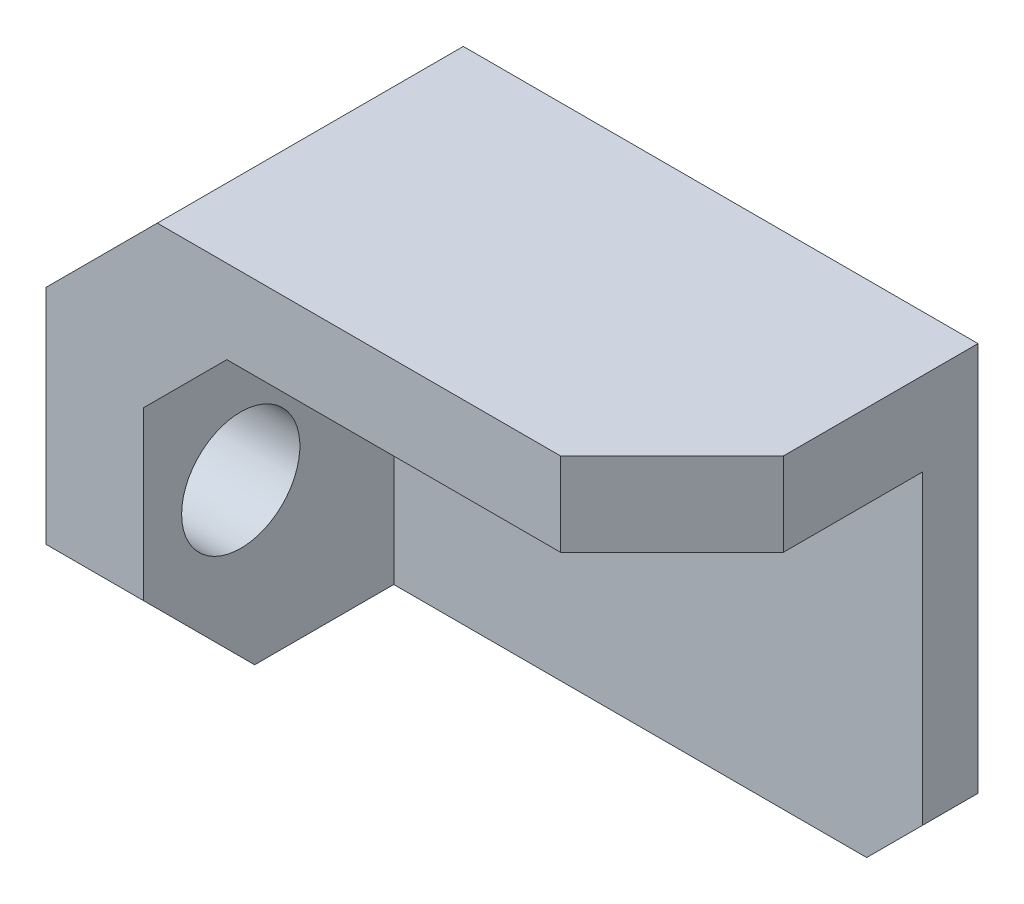
ISO-10303-21;
HEADER;
FILE_DESCRIPTION(('STEP AP214'),'2;1');
FILE_NAME('part.step','',(''),(''),'','','');
FILE_SCHEMA(('AUTOMOTIVE_DESIGN { 1 0 10303 214 1 1 1 1 }'));
ENDSEC;
DATA;
#1=APPLICATION_CONTEXT('core data for automotive mechanical design processes');
#2=APPLICATION_PROTOCOL_DEFINITION('international standard','automotive_design',2000,#1);
#3=PRODUCT_CONTEXT('',#1,'mechanical');
#4=PRODUCT('Part','Part','',(#3));
#5=PRODUCT_RELATED_PRODUCT_CATEGORY('part','',(#4));
#6=PRODUCT_DEFINITION_FORMATION('','',#4);
#7=PRODUCT_DEFINITION_CONTEXT('part definition',#1,'design');
#8=PRODUCT_DEFINITION('design','',#6,#7);
#9=PRODUCT_DEFINITION_SHAPE('','',#8);
#10=(LENGTH_UNIT() NAMED_UNIT(*) SI_UNIT(.MILLI.,.METRE.));
#11=(NAMED_UNIT(*) PLANE_ANGLE_UNIT() SI_UNIT($,.RADIAN.));
#12=(NAMED_UNIT(*) SI_UNIT($,.STERADIAN.) SOLID_ANGLE_UNIT());
#13=UNCERTAINTY_MEASURE_WITH_UNIT(LENGTH_MEASURE(1.E-05),#10,'distance_accuracy_value','');
#14=(GEOMETRIC_REPRESENTATION_CONTEXT(3) GLOBAL_UNCERTAINTY_ASSIGNED_CONTEXT((#13)) GLOBAL_UNIT_ASSIGNED_CONTEXT((#10,
#11,#12)) REPRESENTATION_CONTEXT('',''));
#15=CARTESIAN_POINT('',(0.,0.,0.));
#16=DIRECTION('',(0.,0.,1.));
#17=DIRECTION('',(1.,0.,0.));
#18=AXIS2_PLACEMENT_3D('',#15,#16,#17);
#19=CARTESIAN_POINT('',(0.,0.,22.));
#20=DIRECTION('',(1.,0.,0.));
#21=DIRECTION('',(0.,0.,-1.));
#22=AXIS2_PLACEMENT_3D('',#19,#20,#21);
#23=PLANE('',#22);
#24=CARTESIAN_POINT('',(0.,12.,15.));
#25=DIRECTION('',(1.,0.,0.));
#26=DIRECTION('',(0.,0.,-1.));
#27=AXIS2_PLACEMENT_3D('',#24,#25,#26);
#28=CIRCLE('',#27,4.25000000000001);
#29=CARTESIAN_POINT('',(0.,12.,19.25));
#30=VERTEX_POINT('',#29);
#31=EDGE_CURVE('E162',#30,#30,#28,.T.);
#32=ORIENTED_EDGE('',*,*,#31,.T.);
#33=EDGE_LOOP('',(#32));
#34=FACE_BOUND('',#33,.T.);
#35=DIRECTION('',(0.,-1.,0.));
#36=VECTOR('',#35,1.);
#37=CARTESIAN_POINT('',(0.,0.,22.));
#38=LINE('',#37,#36);
#39=CARTESIAN_POINT('',(0.,24.,22.));
#40=VERTEX_POINT('',#39);
#41=CARTESIAN_POINT('',(0.,8.00000000000001,22.));
#42=VERTEX_POINT('',#41);
#43=EDGE_CURVE('E170',#40,#42,#38,.T.);
#44=ORIENTED_EDGE('',*,*,#43,.F.);
#45=DIRECTION('',(0.,0.,-1.));
#46=VECTOR('',#45,1.);
#47=CARTESIAN_POINT('',(0.,24.,22.));
#48=LINE('',#47,#46);
#49=CARTESIAN_POINT('',(0.,24.,0.));
#50=VERTEX_POINT('',#49);
#51=EDGE_CURVE('E196',#40,#50,#48,.T.);
#52=ORIENTED_EDGE('',*,*,#51,.T.);
#53=DIRECTION('',(0.,-1.,0.));
#54=VECTOR('',#53,1.);
#55=CARTESIAN_POINT('',(0.,0.,0.));
#56=LINE('',#55,#54);
#57=CARTESIAN_POINT('',(0.,0.,0.));
#58=VERTEX_POINT('',#57);
#59=EDGE_CURVE('E169',#50,#58,#56,.T.);
#60=ORIENTED_EDGE('',*,*,#59,.T.);
#61=DIRECTION('',(0.,0.,-1.));
#62=VECTOR('',#61,1.);
#63=CARTESIAN_POINT('',(0.,0.,22.));
#64=LINE('',#63,#62);
#65=CARTESIAN_POINT('',(0.,0.,14.));
#66=VERTEX_POINT('',#65);
#67=EDGE_CURVE('E188',#66,#58,#64,.T.);
#68=ORIENTED_EDGE('',*,*,#67,.F.);
#69=DIRECTION('',(0.,-0.707106781186547,-0.707106781186549));
#70=VECTOR('',#69,1.);
#71=CARTESIAN_POINT('',(0.,8.00000000000001,22.));
#72=LINE('',#71,#70);
#73=EDGE_CURVE('E190',#66,#42,#72,.F.);
#74=ORIENTED_EDGE('',*,*,#73,.T.);
#75=EDGE_LOOP('',(#44,#52,#60,#68,#74));
#76=FACE_BOUND('',#75,.T.);
#77=ADVANCED_FACE('F33',(#34,#76),#23,.F.);
#78=CARTESIAN_POINT('',(0.,0.,22.));
#79=DIRECTION('',(0.,1.,0.));
#80=DIRECTION('',(0.,0.,1.));
#81=AXIS2_PLACEMENT_3D('',#78,#79,#80);
#82=PLANE('',#81);
#83=DIRECTION('',(1.,0.,0.));
#84=VECTOR('',#83,1.);
#85=CARTESIAN_POINT('',(0.,0.,0.));
#86=LINE('',#85,#84);
#87=CARTESIAN_POINT('',(41.,0.,0.));
#88=VERTEX_POINT('',#87);
#89=EDGE_CURVE('E180',#58,#88,#86,.T.);
#90=ORIENTED_EDGE('',*,*,#89,.T.);
#91=DIRECTION('',(0.,0.,1.));
#92=VECTOR('',#91,1.);
#93=CARTESIAN_POINT('',(41.,0.,22.));
#94=LINE('',#93,#92);
#95=CARTESIAN_POINT('',(41.,0.,4.));
#96=VERTEX_POINT('',#95);
#97=EDGE_CURVE('E41',#88,#96,#94,.T.);
#98=ORIENTED_EDGE('',*,*,#97,.T.);
#99=DIRECTION('',(1.,0.,0.));
#100=VECTOR('',#99,1.);
#101=CARTESIAN_POINT('',(7.00000000000001,0.,4.));
#102=LINE('',#101,#100);
#103=CARTESIAN_POINT('',(7.00000000000001,0.,4.));
#104=VERTEX_POINT('',#103);
#105=EDGE_CURVE('E146',#104,#96,#102,.T.);
#106=ORIENTED_EDGE('',*,*,#105,.F.);
#107=DIRECTION('',(0.,0.,-1.));
#108=VECTOR('',#107,1.);
#109=CARTESIAN_POINT('',(7.00000000000001,0.,22.));
#110=LINE('',#109,#108);
#111=CARTESIAN_POINT('',(7.00000000000001,0.,14.));
#112=VERTEX_POINT('',#111);
#113=EDGE_CURVE('E145',#112,#104,#110,.T.);
#114=ORIENTED_EDGE('',*,*,#113,.F.);
#115=DIRECTION('',(-1.,0.,0.));
#116=VECTOR('',#115,1.);
#117=CARTESIAN_POINT('',(0.,0.,14.));
#118=LINE('',#117,#116);
#119=EDGE_CURVE('E220',#112,#66,#118,.T.);
#120=ORIENTED_EDGE('',*,*,#119,.T.);
#121=ORIENTED_EDGE('',*,*,#67,.T.);
#122=EDGE_LOOP('',(#90,#98,#106,#114,#120,#121));
#123=FACE_BOUND('',#122,.T.);
#124=ADVANCED_FACE('F273',(#123),#82,.F.);
#125=CARTESIAN_POINT('',(45.,0.,22.));
#126=DIRECTION('',(-1.,0.,0.));
#127=DIRECTION('',(0.,0.,1.));
#128=AXIS2_PLACEMENT_3D('',#125,#126,#127);
#129=PLANE('',#128);
#130=DIRECTION('',(0.,1.,0.));
#131=VECTOR('',#130,1.);
#132=CARTESIAN_POINT('',(45.,0.,4.));
#133=LINE('',#132,#131);
#134=CARTESIAN_POINT('',(45.,4.,4.));
#135=VERTEX_POINT('',#134);
#136=CARTESIAN_POINT('',(45.,26.,4.));
#137=VERTEX_POINT('',#136);
#138=EDGE_CURVE('E153',#135,#137,#133,.T.);
#139=ORIENTED_EDGE('',*,*,#138,.F.);
#140=DIRECTION('',(0.,0.,-1.));
#141=VECTOR('',#140,1.);
#142=CARTESIAN_POINT('',(45.,4.,22.));
#143=LINE('',#142,#141);
#144=CARTESIAN_POINT('',(45.,4.,0.));
#145=VERTEX_POINT('',#144);
#146=EDGE_CURVE('E222',#135,#145,#143,.T.);
#147=ORIENTED_EDGE('',*,*,#146,.T.);
#148=DIRECTION('',(0.,1.,0.));
#149=VECTOR('',#148,1.);
#150=CARTESIAN_POINT('',(45.,0.,0.));
#151=LINE('',#150,#149);
#152=CARTESIAN_POINT('',(45.,32.,0.));
#153=VERTEX_POINT('',#152);
#154=EDGE_CURVE('E182',#145,#153,#151,.T.);
#155=ORIENTED_EDGE('',*,*,#154,.T.);
#156=DIRECTION('',(0.,0.,-1.));
#157=VECTOR('',#156,1.);
#158=CARTESIAN_POINT('',(45.,32.,22.));
#159=LINE('',#158,#157);
#160=CARTESIAN_POINT('',(45.,32.,14.));
#161=VERTEX_POINT('',#160);
#162=EDGE_CURVE('E177',#161,#153,#159,.T.);
#163=ORIENTED_EDGE('',*,*,#162,.F.);
#164=DIRECTION('',(0.,-1.,0.));
#165=VECTOR('',#164,1.);
#166=CARTESIAN_POINT('',(45.,0.,14.));
#167=LINE('',#166,#165);
#168=CARTESIAN_POINT('',(45.,26.,14.));
#169=VERTEX_POINT('',#168);
#170=EDGE_CURVE('E213',#161,#169,#167,.T.);
#171=ORIENTED_EDGE('',*,*,#170,.T.);
#172=DIRECTION('',(0.,0.,1.));
#173=VECTOR('',#172,1.);
#174=CARTESIAN_POINT('',(45.,26.,22.));
#175=LINE('',#174,#173);
#176=EDGE_CURVE('E155',#137,#169,#175,.T.);
#177=ORIENTED_EDGE('',*,*,#176,.F.);
#178=EDGE_LOOP('',(#139,#147,#155,#163,#171,#177));
#179=FACE_BOUND('',#178,.T.);
#180=ADVANCED_FACE('F228',(#179),#129,.F.);
#181=CARTESIAN_POINT('',(0.,32.,22.));
#182=DIRECTION('',(0.,-1.,0.));
#183=DIRECTION('',(0.,0.,-1.));
#184=AXIS2_PLACEMENT_3D('',#181,#182,#183);
#185=PLANE('',#184);
#186=DIRECTION('',(-1.,0.,0.));
#187=VECTOR('',#186,1.);
#188=CARTESIAN_POINT('',(0.,32.,0.));
#189=LINE('',#188,#187);
#190=CARTESIAN_POINT('',(8.00000000000002,32.,0.));
#191=VERTEX_POINT('',#190);
#192=EDGE_CURVE('E174',#153,#191,#189,.T.);
#193=ORIENTED_EDGE('',*,*,#192,.T.);
#194=DIRECTION('',(0.,0.,1.));
#195=VECTOR('',#194,1.);
#196=CARTESIAN_POINT('',(8.00000000000003,32.,22.));
#197=LINE('',#196,#195);
#198=CARTESIAN_POINT('',(8.00000000000002,32.,22.));
#199=VERTEX_POINT('',#198);
#200=EDGE_CURVE('E203',#191,#199,#197,.T.);
#201=ORIENTED_EDGE('',*,*,#200,.T.);
#202=DIRECTION('',(-1.,0.,0.));
#203=VECTOR('',#202,1.);
#204=CARTESIAN_POINT('',(0.,32.,22.));
#205=LINE('',#204,#203);
#206=CARTESIAN_POINT('',(37.,32.,22.));
#207=VERTEX_POINT('',#206);
#208=EDGE_CURVE('E173',#207,#199,#205,.T.);
#209=ORIENTED_EDGE('',*,*,#208,.F.);
#210=DIRECTION('',(-0.707106781186547,0.,0.707106781186549));
#211=VECTOR('',#210,1.);
#212=CARTESIAN_POINT('',(37.,32.,22.));
#213=LINE('',#212,#211);
#214=EDGE_CURVE('E201',#207,#161,#213,.F.);
#215=ORIENTED_EDGE('',*,*,#214,.T.);
#216=ORIENTED_EDGE('',*,*,#162,.T.);
#217=EDGE_LOOP('',(#193,#201,#209,#215,#216));
#218=FACE_BOUND('',#217,.T.);
#219=ADVANCED_FACE('F238',(#218),#185,.F.);
#220=CARTESIAN_POINT('',(0.,0.,22.));
#221=DIRECTION('',(0.,0.,-1.));
#222=DIRECTION('',(-1.,0.,0.));
#223=AXIS2_PLACEMENT_3D('',#220,#221,#222);
#224=PLANE('',#223);
#225=DIRECTION('',(0.,-1.,0.));
#226=VECTOR('',#225,1.);
#227=CARTESIAN_POINT('',(7.00000000000001,0.,22.));
#228=LINE('',#227,#226);
#229=CARTESIAN_POINT('',(7.00000000000001,20.,22.));
#230=VERTEX_POINT('',#229);
#231=CARTESIAN_POINT('',(7.00000000000001,8.00000000000001,22.));
#232=VERTEX_POINT('',#231);
#233=EDGE_CURVE('E149',#230,#232,#228,.T.);
#234=ORIENTED_EDGE('',*,*,#233,.F.);
#235=DIRECTION('',(0.707106781186548,0.707106781186547,0.));
#236=VECTOR('',#235,1.);
#237=CARTESIAN_POINT('',(13.,26.,22.));
#238=LINE('',#237,#236);
#239=CARTESIAN_POINT('',(13.,26.,22.));
#240=VERTEX_POINT('',#239);
#241=EDGE_CURVE('E127',#230,#240,#238,.T.);
#242=ORIENTED_EDGE('',*,*,#241,.T.);
#243=DIRECTION('',(1.,0.,0.));
#244=VECTOR('',#243,1.);
#245=CARTESIAN_POINT('',(7.00000000000001,26.,22.));
#246=LINE('',#245,#244);
#247=CARTESIAN_POINT('',(37.,26.,22.));
#248=VERTEX_POINT('',#247);
#249=EDGE_CURVE('E158',#240,#248,#246,.T.);
#250=ORIENTED_EDGE('',*,*,#249,.T.);
#251=DIRECTION('',(0.,1.,0.));
#252=VECTOR('',#251,1.);
#253=CARTESIAN_POINT('',(37.,0.,22.));
#254=LINE('',#253,#252);
#255=EDGE_CURVE('E208',#248,#207,#254,.T.);
#256=ORIENTED_EDGE('',*,*,#255,.T.);
#257=ORIENTED_EDGE('',*,*,#208,.T.);
#258=DIRECTION('',(0.707106781186549,0.707106781186547,0.));
#259=VECTOR('',#258,1.);
#260=CARTESIAN_POINT('',(0.,24.,22.));
#261=LINE('',#260,#259);
#262=EDGE_CURVE('E211',#199,#40,#261,.F.);
#263=ORIENTED_EDGE('',*,*,#262,.T.);
#264=ORIENTED_EDGE('',*,*,#43,.T.);
#265=DIRECTION('',(1.,0.,0.));
#266=VECTOR('',#265,1.);
#267=CARTESIAN_POINT('',(0.,8.00000000000001,22.));
#268=LINE('',#267,#266);
#269=EDGE_CURVE('E205',#42,#232,#268,.T.);
#270=ORIENTED_EDGE('',*,*,#269,.T.);
#271=EDGE_LOOP('',(#234,#242,#250,#256,#257,#263,#264,#270));
#272=FACE_BOUND('',#271,.T.);
#273=ADVANCED_FACE('F246',(#272),#224,.F.);
#274=CARTESIAN_POINT('',(0.,0.,0.));
#275=DIRECTION('',(0.,0.,-1.));
#276=DIRECTION('',(-1.,0.,0.));
#277=AXIS2_PLACEMENT_3D('',#274,#275,#276);
#278=PLANE('',#277);
#279=CARTESIAN_POINT('',(22.5,16.,0.));
#280=DIRECTION('',(0.,0.,1.));
#281=DIRECTION('',(1.,0.,0.));
#282=AXIS2_PLACEMENT_3D('',#279,#280,#281);
#283=CIRCLE('',#282,5.25);
#284=CARTESIAN_POINT('',(27.75,16.,0.));
#285=VERTEX_POINT('',#284);
#286=EDGE_CURVE('E165',#285,#285,#283,.T.);
#287=ORIENTED_EDGE('',*,*,#286,.T.);
#288=EDGE_LOOP('',(#287));
#289=FACE_BOUND('',#288,.T.);
#290=ORIENTED_EDGE('',*,*,#154,.F.);
#291=DIRECTION('',(0.707106781186549,0.707106781186546,0.));
#292=VECTOR('',#291,1.);
#293=CARTESIAN_POINT('',(20.4999999999999,-20.5,0.));
#294=LINE('',#293,#292);
#295=EDGE_CURVE('E55',#145,#88,#294,.F.);
#296=ORIENTED_EDGE('',*,*,#295,.T.);
#297=ORIENTED_EDGE('',*,*,#89,.F.);
#298=ORIENTED_EDGE('',*,*,#59,.F.);
#299=DIRECTION('',(-0.707106781186549,-0.707106781186547,0.));
#300=VECTOR('',#299,1.);
#301=CARTESIAN_POINT('',(-12.,12.,0.));
#302=LINE('',#301,#300);
#303=EDGE_CURVE('E199',#50,#191,#302,.F.);
#304=ORIENTED_EDGE('',*,*,#303,.T.);
#305=ORIENTED_EDGE('',*,*,#192,.F.);
#306=EDGE_LOOP('',(#290,#296,#297,#298,#304,#305));
#307=FACE_BOUND('',#306,.T.);
#308=ADVANCED_FACE('F234',(#289,#307),#278,.T.);
#309=CARTESIAN_POINT('',(22.5,16.,0.));
#310=DIRECTION('',(0.,0.,1.));
#311=DIRECTION('',(1.,0.,0.));
#312=AXIS2_PLACEMENT_3D('',#309,#310,#311);
#313=CYLINDRICAL_SURFACE('',#312,5.25);
#314=CARTESIAN_POINT('',(22.5,16.,4.));
#315=DIRECTION('',(0.,0.,-1.));
#316=DIRECTION('',(-1.,0.,0.));
#317=AXIS2_PLACEMENT_3D('',#314,#315,#316);
#318=CIRCLE('',#317,5.25);
#319=CARTESIAN_POINT('',(17.25,16.,4.));
#320=VERTEX_POINT('',#319);
#321=EDGE_CURVE('E166',#320,#320,#318,.F.);
#322=ORIENTED_EDGE('',*,*,#321,.T.);
#323=EDGE_LOOP('',(#322));
#324=FACE_BOUND('',#323,.T.);
#325=ORIENTED_EDGE('',*,*,#286,.F.);
#326=EDGE_LOOP('',(#325));
#327=FACE_BOUND('',#326,.T.);
#328=ADVANCED_FACE('F287',(#324,#327),#313,.F.);
#329=CARTESIAN_POINT('',(45.,12.,15.));
#330=DIRECTION('',(-1.,0.,0.));
#331=DIRECTION('',(0.,0.,1.));
#332=AXIS2_PLACEMENT_3D('',#329,#330,#331);
#333=CYLINDRICAL_SURFACE('',#332,4.25000000000001);
#334=CARTESIAN_POINT('',(7.00000000000001,12.,15.));
#335=DIRECTION('',(-1.,0.,0.));
#336=DIRECTION('',(0.,0.,1.));
#337=AXIS2_PLACEMENT_3D('',#334,#335,#336);
#338=CIRCLE('',#337,4.25000000000001);
#339=CARTESIAN_POINT('',(7.00000000000001,12.,19.25));
#340=VERTEX_POINT('',#339);
#341=EDGE_CURVE('E160',#340,#340,#338,.F.);
#342=CARTESIAN_POINT('',(7.00000000000001,12.,19.25));
#343=CARTESIAN_POINT('',(6.92708333333334,12.,19.25));
#344=CARTESIAN_POINT('',(6.85416666666668,12.,19.25));
#345=CARTESIAN_POINT('',(6.70833333333334,12.,19.25));
#346=CARTESIAN_POINT('',(6.63541666666668,12.,19.25));
#347=CARTESIAN_POINT('',(6.48958333333334,12.,19.25));
#348=CARTESIAN_POINT('',(6.41666666666668,12.,19.25));
#349=CARTESIAN_POINT('',(6.27083333333334,12.,19.25));
#350=CARTESIAN_POINT('',(6.19791666666668,12.,19.25));
#351=CARTESIAN_POINT('',(6.05208333333334,12.,19.25));
#352=CARTESIAN_POINT('',(5.97916666666668,12.,19.25));
#353=CARTESIAN_POINT('',(5.83333333333334,12.,19.25));
#354=CARTESIAN_POINT('',(5.76041666666668,12.,19.25));
#355=CARTESIAN_POINT('',(5.61458333333334,12.,19.25));
#356=CARTESIAN_POINT('',(5.54166666666668,12.,19.25));
#357=CARTESIAN_POINT('',(5.39583333333334,12.,19.25));
#358=CARTESIAN_POINT('',(5.32291666666668,12.,19.25));
#359=CARTESIAN_POINT('',(5.17708333333334,12.,19.25));
#360=CARTESIAN_POINT('',(5.10416666666668,12.,19.25));
#361=CARTESIAN_POINT('',(4.95833333333334,12.,19.25));
#362=CARTESIAN_POINT('',(4.88541666666667,12.,19.25));
#363=CARTESIAN_POINT('',(4.73958333333334,12.,19.25));
#364=CARTESIAN_POINT('',(4.66666666666667,12.,19.25));
#365=CARTESIAN_POINT('',(4.52083333333334,12.,19.25));
#366=CARTESIAN_POINT('',(4.44791666666667,12.,19.25));
#367=CARTESIAN_POINT('',(4.30208333333334,12.,19.25));
#368=CARTESIAN_POINT('',(4.22916666666667,12.,19.25));
#369=CARTESIAN_POINT('',(4.08333333333334,12.,19.25));
#370=CARTESIAN_POINT('',(4.01041666666667,12.,19.25));
#371=CARTESIAN_POINT('',(3.86458333333334,12.,19.25));
#372=CARTESIAN_POINT('',(3.79166666666667,12.,19.25));
#373=CARTESIAN_POINT('',(3.64583333333334,12.,19.25));
#374=CARTESIAN_POINT('',(3.57291666666667,12.,19.25));
#375=CARTESIAN_POINT('',(3.42708333333334,12.,19.25));
#376=CARTESIAN_POINT('',(3.35416666666667,12.,19.25));
#377=CARTESIAN_POINT('',(3.20833333333333,12.,19.25));
#378=CARTESIAN_POINT('',(3.13541666666667,12.,19.25));
#379=CARTESIAN_POINT('',(2.98958333333333,12.,19.25));
#380=CARTESIAN_POINT('',(2.91666666666667,12.,19.25));
#381=CARTESIAN_POINT('',(2.77083333333333,12.,19.25));
#382=CARTESIAN_POINT('',(2.69791666666667,12.,19.25));
#383=CARTESIAN_POINT('',(2.55208333333333,12.,19.25));
#384=CARTESIAN_POINT('',(2.47916666666667,12.,19.25));
#385=CARTESIAN_POINT('',(2.33333333333333,12.,19.25));
#386=CARTESIAN_POINT('',(2.26041666666667,12.,19.25));
#387=CARTESIAN_POINT('',(2.11458333333333,12.,19.25));
#388=CARTESIAN_POINT('',(2.04166666666667,12.,19.25));
#389=CARTESIAN_POINT('',(1.89583333333333,12.,19.25));
#390=CARTESIAN_POINT('',(1.82291666666666,12.,19.25));
#391=CARTESIAN_POINT('',(1.67708333333333,12.,19.25));
#392=CARTESIAN_POINT('',(1.60416666666666,12.,19.25));
#393=CARTESIAN_POINT('',(1.45833333333333,12.,19.25));
#394=CARTESIAN_POINT('',(1.38541666666666,12.,19.25));
#395=CARTESIAN_POINT('',(1.23958333333333,12.,19.25));
#396=CARTESIAN_POINT('',(1.16666666666666,12.,19.25));
#397=CARTESIAN_POINT('',(1.02083333333333,12.,19.25));
#398=CARTESIAN_POINT('',(0.947916666666662,12.,19.25));
#399=CARTESIAN_POINT('',(0.802083333333328,12.,19.25));
#400=CARTESIAN_POINT('',(0.729166666666663,12.,19.25));
#401=CARTESIAN_POINT('',(0.583333333333329,12.,19.25));
#402=CARTESIAN_POINT('',(0.510416666666661,12.,19.25));
#403=CARTESIAN_POINT('',(0.364583333333328,12.,19.25));
#404=CARTESIAN_POINT('',(0.291666666666662,12.,19.25));
#405=CARTESIAN_POINT('',(0.145833333333329,12.,19.25));
#406=CARTESIAN_POINT('',(0.0729166666666608,12.,19.25));
#407=CARTESIAN_POINT('',(0.,12.,19.25));
#408=B_SPLINE_CURVE_WITH_KNOTS('',3,(#342,#343,#344,#345,#346,#347,#348,#349,#350,#351,#352,
#353,#354,#355,#356,#357,#358,#359,#360,#361,#362,#363,#364,#365,#366,#367,#368,#369,#370,#371,
#372,#373,#374,#375,#376,#377,#378,#379,#380,#381,#382,#383,#384,#385,#386,#387,#388,#389,#390,
#391,#392,#393,#394,#395,#396,#397,#398,#399,#400,#401,#402,#403,#404,#405,#406,#407),
.UNSPECIFIED.,.F.,.F.,(4,2,2,2,2,2,2,2,2,2,2,2,2,2,2,2,2,2,2,2,2,2,2,2,2,2,2,2,2,2,2,2,4),(0.,
0.218750000000004,0.4375,0.656250000000004,0.875000000000001,1.09375,1.3125,1.53125,1.75,
1.96875000000001,2.18750000000001,2.40625000000001,2.62500000000001,2.84375000000001,
3.06250000000001,3.28125000000001,3.50000000000001,3.71875000000001,3.93750000000001,
4.15625000000001,4.37500000000001,4.59375000000001,4.81250000000001,5.03125000000002,
5.25000000000002,5.46875000000002,5.68750000000002,5.90625000000002,6.12500000000002,
6.34375000000002,6.56250000000002,6.78125000000002,7.00000000000002),.UNSPECIFIED.);
#409=EDGE_CURVE('BSEAM293',#340,#30,#408,.T.);
#410=ORIENTED_EDGE('',*,*,#341,.T.);
#411=ORIENTED_EDGE('',*,*,#31,.F.);
#412=ORIENTED_EDGE('',*,*,#409,.T.);
#413=ORIENTED_EDGE('',*,*,#409,.F.);
#414=EDGE_LOOP('',(#410,#412,#411,#413));
#415=FACE_BOUND('',#414,.T.);
#416=ADVANCED_FACE('F293',(#415),#333,.F.);
#417=CARTESIAN_POINT('',(7.00000000000001,0.,4.));
#418=DIRECTION('',(0.,0.,-1.));
#419=DIRECTION('',(-1.,0.,0.));
#420=AXIS2_PLACEMENT_3D('',#417,#418,#419);
#421=PLANE('',#420);
#422=ORIENTED_EDGE('',*,*,#105,.T.);
#423=DIRECTION('',(-0.707106781186549,-0.707106781186546,0.));
#424=VECTOR('',#423,1.);
#425=CARTESIAN_POINT('',(45.,4.,4.));
#426=LINE('',#425,#424);
#427=EDGE_CURVE('E11',#96,#135,#426,.F.);
#428=ORIENTED_EDGE('',*,*,#427,.T.);
#429=ORIENTED_EDGE('',*,*,#138,.T.);
#430=DIRECTION('',(1.,0.,0.));
#431=VECTOR('',#430,1.);
#432=CARTESIAN_POINT('',(7.00000000000001,26.,4.));
#433=LINE('',#432,#431);
#434=CARTESIAN_POINT('',(13.,26.,4.));
#435=VERTEX_POINT('',#434);
#436=EDGE_CURVE('E140',#435,#137,#433,.T.);
#437=ORIENTED_EDGE('',*,*,#436,.F.);
#438=DIRECTION('',(0.707106781186548,0.707106781186547,0.));
#439=VECTOR('',#438,1.);
#440=CARTESIAN_POINT('',(13.,26.,4.));
#441=LINE('',#440,#439);
#442=CARTESIAN_POINT('',(7.00000000000001,20.,4.));
#443=VERTEX_POINT('',#442);
#444=EDGE_CURVE('E125',#443,#435,#441,.T.);
#445=ORIENTED_EDGE('',*,*,#444,.F.);
#446=DIRECTION('',(0.,1.,0.));
#447=VECTOR('',#446,1.);
#448=CARTESIAN_POINT('',(7.00000000000001,0.,4.));
#449=LINE('',#448,#447);
#450=EDGE_CURVE('E138',#104,#443,#449,.T.);
#451=ORIENTED_EDGE('',*,*,#450,.F.);
#452=EDGE_LOOP('',(#422,#428,#429,#437,#445,#451));
#453=FACE_BOUND('',#452,.T.);
#454=ORIENTED_EDGE('',*,*,#321,.F.);
#455=EDGE_LOOP('',(#454));
#456=FACE_BOUND('',#455,.T.);
#457=ADVANCED_FACE('F136',(#453,#456),#421,.F.);
#458=CARTESIAN_POINT('',(7.00000000000001,0.,0.));
#459=DIRECTION('',(-1.,0.,0.));
#460=DIRECTION('',(0.,0.,1.));
#461=AXIS2_PLACEMENT_3D('',#458,#459,#460);
#462=PLANE('',#461);
#463=ORIENTED_EDGE('',*,*,#450,.T.);
#464=DIRECTION('',(0.,0.,1.));
#465=VECTOR('',#464,1.);
#466=CARTESIAN_POINT('',(7.00000000000001,20.,4.));
#467=LINE('',#466,#465);
#468=EDGE_CURVE('E121',#443,#230,#467,.T.);
#469=ORIENTED_EDGE('',*,*,#468,.T.);
#470=ORIENTED_EDGE('',*,*,#233,.T.);
#471=DIRECTION('',(0.,0.707106781186547,0.707106781186549));
#472=VECTOR('',#471,1.);
#473=CARTESIAN_POINT('',(7.00000000000001,8.00000000000001,22.));
#474=LINE('',#473,#472);
#475=EDGE_CURVE('E218',#232,#112,#474,.F.);
#476=ORIENTED_EDGE('',*,*,#475,.T.);
#477=ORIENTED_EDGE('',*,*,#113,.T.);
#478=EDGE_LOOP('',(#463,#469,#470,#476,#477));
#479=FACE_BOUND('',#478,.T.);
#480=ORIENTED_EDGE('',*,*,#341,.F.);
#481=EDGE_LOOP('',(#480));
#482=FACE_BOUND('',#481,.T.);
#483=ADVANCED_FACE('F142',(#479,#482),#462,.F.);
#484=CARTESIAN_POINT('',(7.00000000000001,26.,22.));
#485=DIRECTION('',(0.,1.,0.));
#486=DIRECTION('',(0.,0.,1.));
#487=AXIS2_PLACEMENT_3D('',#484,#485,#486);
#488=PLANE('',#487);
#489=ORIENTED_EDGE('',*,*,#249,.F.);
#490=DIRECTION('',(0.,0.,1.));
#491=VECTOR('',#490,1.);
#492=CARTESIAN_POINT('',(13.,26.,4.));
#493=LINE('',#492,#491);
#494=EDGE_CURVE('E131',#435,#240,#493,.T.);
#495=ORIENTED_EDGE('',*,*,#494,.F.);
#496=ORIENTED_EDGE('',*,*,#436,.T.);
#497=ORIENTED_EDGE('',*,*,#176,.T.);
#498=DIRECTION('',(0.707106781186547,0.,-0.707106781186549));
#499=VECTOR('',#498,1.);
#500=CARTESIAN_POINT('',(37.,26.,22.));
#501=LINE('',#500,#499);
#502=EDGE_CURVE('E215',#169,#248,#501,.F.);
#503=ORIENTED_EDGE('',*,*,#502,.T.);
#504=EDGE_LOOP('',(#489,#495,#496,#497,#503));
#505=FACE_BOUND('',#504,.T.);
#506=ADVANCED_FACE('F259',(#505),#488,.F.);
#507=CARTESIAN_POINT('',(0.,24.,22.));
#508=DIRECTION('',(0.707106781186547,-0.707106781186549,0.));
#509=DIRECTION('',(0.,0.,-1.));
#510=AXIS2_PLACEMENT_3D('',#507,#508,#509);
#511=PLANE('',#510);
#512=ORIENTED_EDGE('',*,*,#262,.F.);
#513=ORIENTED_EDGE('',*,*,#200,.F.);
#514=ORIENTED_EDGE('',*,*,#303,.F.);
#515=ORIENTED_EDGE('',*,*,#51,.F.);
#516=EDGE_LOOP('',(#512,#513,#514,#515));
#517=FACE_BOUND('',#516,.T.);
#518=ADVANCED_FACE('F242',(#517),#511,.F.);
#519=CARTESIAN_POINT('',(37.,0.,22.));
#520=DIRECTION('',(-0.707106781186549,0.,-0.707106781186547));
#521=DIRECTION('',(0.,1.,0.));
#522=AXIS2_PLACEMENT_3D('',#519,#520,#521);
#523=PLANE('',#522);
#524=ORIENTED_EDGE('',*,*,#502,.F.);
#525=ORIENTED_EDGE('',*,*,#170,.F.);
#526=ORIENTED_EDGE('',*,*,#214,.F.);
#527=ORIENTED_EDGE('',*,*,#255,.F.);
#528=EDGE_LOOP('',(#524,#525,#526,#527));
#529=FACE_BOUND('',#528,.T.);
#530=ADVANCED_FACE('F264',(#529),#523,.F.);
#531=CARTESIAN_POINT('',(0.,8.00000000000001,22.));
#532=DIRECTION('',(0.,0.707106781186549,-0.707106781186547));
#533=DIRECTION('',(1.,0.,0.));
#534=AXIS2_PLACEMENT_3D('',#531,#532,#533);
#535=PLANE('',#534);
#536=ORIENTED_EDGE('',*,*,#73,.F.);
#537=ORIENTED_EDGE('',*,*,#119,.F.);
#538=ORIENTED_EDGE('',*,*,#475,.F.);
#539=ORIENTED_EDGE('',*,*,#269,.F.);
#540=EDGE_LOOP('',(#536,#537,#538,#539));
#541=FACE_BOUND('',#540,.T.);
#542=ADVANCED_FACE('F253',(#541),#535,.F.);
#543=CARTESIAN_POINT('',(13.,26.,4.));
#544=DIRECTION('',(0.707106781186547,-0.707106781186548,0.));
#545=DIRECTION('',(0.707106781186548,0.707106781186547,0.));
#546=AXIS2_PLACEMENT_3D('',#543,#544,#545);
#547=PLANE('',#546);
#548=ORIENTED_EDGE('',*,*,#241,.F.);
#549=ORIENTED_EDGE('',*,*,#468,.F.);
#550=ORIENTED_EDGE('',*,*,#444,.T.);
#551=ORIENTED_EDGE('',*,*,#494,.T.);
#552=EDGE_LOOP('',(#548,#549,#550,#551));
#553=FACE_BOUND('',#552,.T.);
#554=ADVANCED_FACE('F123',(#553),#547,.T.);
#555=CARTESIAN_POINT('',(45.,4.,22.));
#556=DIRECTION('',(-0.707106781186546,0.707106781186549,0.));
#557=DIRECTION('',(0.,0.,-1.));
#558=AXIS2_PLACEMENT_3D('',#555,#556,#557);
#559=PLANE('',#558);
#560=ORIENTED_EDGE('',*,*,#427,.F.);
#561=ORIENTED_EDGE('',*,*,#97,.F.);
#562=ORIENTED_EDGE('',*,*,#295,.F.);
#563=ORIENTED_EDGE('',*,*,#146,.F.);
#564=EDGE_LOOP('',(#560,#561,#562,#563));
#565=FACE_BOUND('',#564,.T.);
#566=ADVANCED_FACE('F35',(#565),#559,.F.);
#567=CLOSED_SHELL('',(#77,#124,#180,#219,#273,#308,#328,#416,#457,#483,#506,#518,#530,#542,#554,#566));
#568=MANIFOLD_SOLID_BREP('B2',#567);
#569=ADVANCED_BREP_SHAPE_REPRESENTATION('',(#18,#568),#14);
#570=SHAPE_DEFINITION_REPRESENTATION(#9,#569);
ENDSEC;
END-ISO-10303-21;
